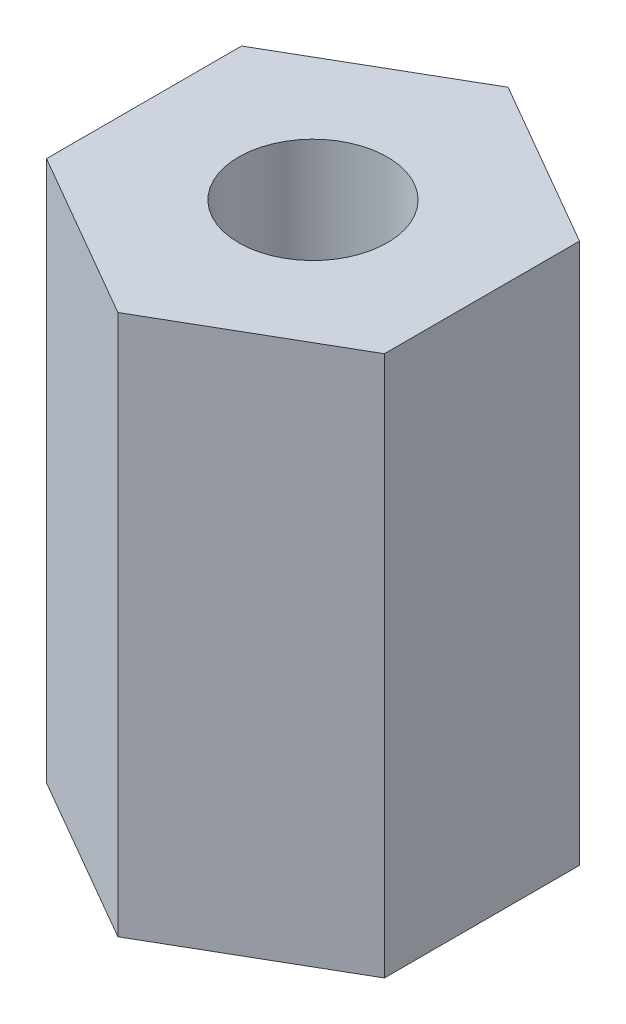
ISO-10303-21;
HEADER;
FILE_DESCRIPTION(('STEP AP214'),'2;1');
FILE_NAME('part.step','',(''),(''),'','','');
FILE_SCHEMA(('AUTOMOTIVE_DESIGN { 1 0 10303 214 1 1 1 1 }'));
ENDSEC;
DATA;
#1=APPLICATION_CONTEXT('core data for automotive mechanical design processes');
#2=APPLICATION_PROTOCOL_DEFINITION('international standard','automotive_design',2000,#1);
#3=PRODUCT_CONTEXT('',#1,'mechanical');
#4=PRODUCT('Part','Part','',(#3));
#5=PRODUCT_RELATED_PRODUCT_CATEGORY('part','',(#4));
#6=PRODUCT_DEFINITION_FORMATION('','',#4);
#7=PRODUCT_DEFINITION_CONTEXT('part definition',#1,'design');
#8=PRODUCT_DEFINITION('design','',#6,#7);
#9=PRODUCT_DEFINITION_SHAPE('','',#8);
#10=(LENGTH_UNIT() NAMED_UNIT(*) SI_UNIT(.MILLI.,.METRE.));
#11=(NAMED_UNIT(*) PLANE_ANGLE_UNIT() SI_UNIT($,.RADIAN.));
#12=(NAMED_UNIT(*) SI_UNIT($,.STERADIAN.) SOLID_ANGLE_UNIT());
#13=UNCERTAINTY_MEASURE_WITH_UNIT(LENGTH_MEASURE(1.E-05),#10,'distance_accuracy_value','');
#14=(GEOMETRIC_REPRESENTATION_CONTEXT(3) GLOBAL_UNCERTAINTY_ASSIGNED_CONTEXT((#13)) GLOBAL_UNIT_ASSIGNED_CONTEXT((#10,
#11,#12)) REPRESENTATION_CONTEXT('',''));
#15=CARTESIAN_POINT('',(0.,0.,0.));
#16=DIRECTION('',(0.,0.,1.));
#17=DIRECTION('',(1.,0.,0.));
#18=AXIS2_PLACEMENT_3D('',#15,#16,#17);
#19=CARTESIAN_POINT('',(0.,8.,0.));
#20=DIRECTION('',(0.,1.,0.));
#21=DIRECTION('',(0.,0.,1.));
#22=AXIS2_PLACEMENT_3D('',#19,#20,#21);
#23=PLANE('',#22);
#24=DIRECTION('',(-0.866025403784439,0.,-0.5));
#25=VECTOR('',#24,1.);
#26=CARTESIAN_POINT('',(2.5,8.,-1.44337567297407));
#27=LINE('',#26,#25);
#28=CARTESIAN_POINT('',(2.5,8.,-1.44337567297407));
#29=VERTEX_POINT('',#28);
#30=CARTESIAN_POINT('',(0.,8.,-2.88675134594813));
#31=VERTEX_POINT('',#30);
#32=EDGE_CURVE('E146',#29,#31,#27,.T.);
#33=ORIENTED_EDGE('',*,*,#32,.T.);
#34=DIRECTION('',(-0.866025403784439,0.,0.5));
#35=VECTOR('',#34,1.);
#36=CARTESIAN_POINT('',(0.,8.,-2.88675134594813));
#37=LINE('',#36,#35);
#38=CARTESIAN_POINT('',(-2.5,8.,-1.44337567297406));
#39=VERTEX_POINT('',#38);
#40=EDGE_CURVE('E94',#31,#39,#37,.T.);
#41=ORIENTED_EDGE('',*,*,#40,.T.);
#42=DIRECTION('',(0.,0.,1.));
#43=VECTOR('',#42,1.);
#44=CARTESIAN_POINT('',(-2.5,8.,-1.44337567297406));
#45=LINE('',#44,#43);
#46=CARTESIAN_POINT('',(-2.5,8.,1.44337567297406));
#47=VERTEX_POINT('',#46);
#48=EDGE_CURVE('E107',#39,#47,#45,.T.);
#49=ORIENTED_EDGE('',*,*,#48,.T.);
#50=DIRECTION('',(0.866025403784439,0.,0.5));
#51=VECTOR('',#50,1.);
#52=CARTESIAN_POINT('',(-2.5,8.,1.44337567297406));
#53=LINE('',#52,#51);
#54=CARTESIAN_POINT('',(0.,8.,2.88675134594813));
#55=VERTEX_POINT('',#54);
#56=EDGE_CURVE('E101',#47,#55,#53,.T.);
#57=ORIENTED_EDGE('',*,*,#56,.T.);
#58=DIRECTION('',(0.866025403784439,0.,-0.5));
#59=VECTOR('',#58,1.);
#60=CARTESIAN_POINT('',(0.,8.,2.88675134594813));
#61=LINE('',#60,#59);
#62=CARTESIAN_POINT('',(2.5,8.,1.44337567297406));
#63=VERTEX_POINT('',#62);
#64=EDGE_CURVE('E105',#55,#63,#61,.T.);
#65=ORIENTED_EDGE('',*,*,#64,.T.);
#66=DIRECTION('',(0.,0.,-1.));
#67=VECTOR('',#66,1.);
#68=CARTESIAN_POINT('',(2.5,8.,1.44337567297406));
#69=LINE('',#68,#67);
#70=EDGE_CURVE('E57',#63,#29,#69,.T.);
#71=ORIENTED_EDGE('',*,*,#70,.T.);
#72=EDGE_LOOP('',(#33,#41,#49,#57,#65,#71));
#73=FACE_BOUND('',#72,.T.);
#74=CARTESIAN_POINT('',(0.,8.,0.));
#75=DIRECTION('',(0.,1.,0.));
#76=DIRECTION('',(0.,0.,1.));
#77=AXIS2_PLACEMENT_3D('',#74,#75,#76);
#78=CIRCLE('',#77,1.1);
#79=CARTESIAN_POINT('',(0.,8.,1.1));
#80=VERTEX_POINT('',#79);
#81=EDGE_CURVE('E134',#80,#80,#78,.T.);
#82=ORIENTED_EDGE('',*,*,#81,.F.);
#83=EDGE_LOOP('',(#82));
#84=FACE_BOUND('',#83,.T.);
#85=ADVANCED_FACE('F39',(#73,#84),#23,.T.);
#86=CARTESIAN_POINT('',(0.,0.,0.));
#87=DIRECTION('',(0.,1.,0.));
#88=DIRECTION('',(0.,0.,1.));
#89=AXIS2_PLACEMENT_3D('',#86,#87,#88);
#90=PLANE('',#89);
#91=DIRECTION('',(-0.866025403784439,0.,-0.5));
#92=VECTOR('',#91,1.);
#93=CARTESIAN_POINT('',(2.5,0.,-1.44337567297407));
#94=LINE('',#93,#92);
#95=CARTESIAN_POINT('',(2.5,0.,-1.44337567297407));
#96=VERTEX_POINT('',#95);
#97=CARTESIAN_POINT('',(0.,0.,-2.88675134594813));
#98=VERTEX_POINT('',#97);
#99=EDGE_CURVE('E129',#96,#98,#94,.T.);
#100=ORIENTED_EDGE('',*,*,#99,.F.);
#101=DIRECTION('',(0.,0.,-1.));
#102=VECTOR('',#101,1.);
#103=CARTESIAN_POINT('',(2.5,0.,1.44337567297406));
#104=LINE('',#103,#102);
#105=CARTESIAN_POINT('',(2.5,0.,1.44337567297406));
#106=VERTEX_POINT('',#105);
#107=EDGE_CURVE('E86',#106,#96,#104,.T.);
#108=ORIENTED_EDGE('',*,*,#107,.F.);
#109=DIRECTION('',(0.866025403784439,0.,-0.5));
#110=VECTOR('',#109,1.);
#111=CARTESIAN_POINT('',(0.,0.,2.88675134594813));
#112=LINE('',#111,#110);
#113=CARTESIAN_POINT('',(0.,0.,2.88675134594813));
#114=VERTEX_POINT('',#113);
#115=EDGE_CURVE('E80',#114,#106,#112,.T.);
#116=ORIENTED_EDGE('',*,*,#115,.F.);
#117=DIRECTION('',(0.866025403784439,0.,0.5));
#118=VECTOR('',#117,1.);
#119=CARTESIAN_POINT('',(-2.5,0.,1.44337567297406));
#120=LINE('',#119,#118);
#121=CARTESIAN_POINT('',(-2.5,0.,1.44337567297406));
#122=VERTEX_POINT('',#121);
#123=EDGE_CURVE('E116',#122,#114,#120,.T.);
#124=ORIENTED_EDGE('',*,*,#123,.F.);
#125=DIRECTION('',(0.,0.,1.));
#126=VECTOR('',#125,1.);
#127=CARTESIAN_POINT('',(-2.5,0.,-1.44337567297406));
#128=LINE('',#127,#126);
#129=CARTESIAN_POINT('',(-2.5,0.,-1.44337567297406));
#130=VERTEX_POINT('',#129);
#131=EDGE_CURVE('E137',#130,#122,#128,.T.);
#132=ORIENTED_EDGE('',*,*,#131,.F.);
#133=DIRECTION('',(-0.866025403784439,0.,0.5));
#134=VECTOR('',#133,1.);
#135=CARTESIAN_POINT('',(0.,0.,-2.88675134594813));
#136=LINE('',#135,#134);
#137=EDGE_CURVE('E133',#98,#130,#136,.T.);
#138=ORIENTED_EDGE('',*,*,#137,.F.);
#139=EDGE_LOOP('',(#100,#108,#116,#124,#132,#138));
#140=FACE_BOUND('',#139,.T.);
#141=CARTESIAN_POINT('',(0.,0.,0.));
#142=DIRECTION('',(0.,1.,0.));
#143=DIRECTION('',(0.,0.,1.));
#144=AXIS2_PLACEMENT_3D('',#141,#142,#143);
#145=CIRCLE('',#144,1.1);
#146=CARTESIAN_POINT('',(0.,0.,1.1));
#147=VERTEX_POINT('',#146);
#148=EDGE_CURVE('E243',#147,#147,#145,.T.);
#149=ORIENTED_EDGE('',*,*,#148,.T.);
#150=EDGE_LOOP('',(#149));
#151=FACE_BOUND('',#150,.T.);
#152=ADVANCED_FACE('F159',(#140,#151),#90,.F.);
#153=CARTESIAN_POINT('',(2.5,8.,-1.44337567297407));
#154=DIRECTION('',(-0.5,0.,0.866025403784439));
#155=DIRECTION('',(0.866025403784439,0.,0.5));
#156=AXIS2_PLACEMENT_3D('',#153,#154,#155);
#157=PLANE('',#156);
#158=ORIENTED_EDGE('',*,*,#99,.T.);
#159=DIRECTION('',(0.,-1.,0.));
#160=VECTOR('',#159,1.);
#161=CARTESIAN_POINT('',(0.,8.,-2.88675134594813));
#162=LINE('',#161,#160);
#163=EDGE_CURVE('E11',#31,#98,#162,.T.);
#164=ORIENTED_EDGE('',*,*,#163,.F.);
#165=ORIENTED_EDGE('',*,*,#32,.F.);
#166=DIRECTION('',(0.,-1.,0.));
#167=VECTOR('',#166,1.);
#168=CARTESIAN_POINT('',(2.5,8.,-1.44337567297407));
#169=LINE('',#168,#167);
#170=EDGE_CURVE('E125',#29,#96,#169,.T.);
#171=ORIENTED_EDGE('',*,*,#170,.T.);
#172=EDGE_LOOP('',(#158,#164,#165,#171));
#173=FACE_BOUND('',#172,.T.);
#174=ADVANCED_FACE('F41',(#173),#157,.F.);
#175=CARTESIAN_POINT('',(0.,8.,-2.88675134594813));
#176=DIRECTION('',(0.5,0.,0.866025403784439));
#177=DIRECTION('',(0.866025403784439,0.,-0.5));
#178=AXIS2_PLACEMENT_3D('',#175,#176,#177);
#179=PLANE('',#178);
#180=ORIENTED_EDGE('',*,*,#137,.T.);
#181=DIRECTION('',(0.,-1.,0.));
#182=VECTOR('',#181,1.);
#183=CARTESIAN_POINT('',(-2.5,8.,-1.44337567297406));
#184=LINE('',#183,#182);
#185=EDGE_CURVE('E49',#39,#130,#184,.T.);
#186=ORIENTED_EDGE('',*,*,#185,.F.);
#187=ORIENTED_EDGE('',*,*,#40,.F.);
#188=ORIENTED_EDGE('',*,*,#163,.T.);
#189=EDGE_LOOP('',(#180,#186,#187,#188));
#190=FACE_BOUND('',#189,.T.);
#191=ADVANCED_FACE('F184',(#190),#179,.F.);
#192=CARTESIAN_POINT('',(-2.5,8.,-1.44337567297406));
#193=DIRECTION('',(1.,0.,0.));
#194=DIRECTION('',(0.,0.,-1.));
#195=AXIS2_PLACEMENT_3D('',#192,#193,#194);
#196=PLANE('',#195);
#197=ORIENTED_EDGE('',*,*,#131,.T.);
#198=DIRECTION('',(0.,-1.,0.));
#199=VECTOR('',#198,1.);
#200=CARTESIAN_POINT('',(-2.5,8.,1.44337567297406));
#201=LINE('',#200,#199);
#202=EDGE_CURVE('E118',#47,#122,#201,.T.);
#203=ORIENTED_EDGE('',*,*,#202,.F.);
#204=ORIENTED_EDGE('',*,*,#48,.F.);
#205=ORIENTED_EDGE('',*,*,#185,.T.);
#206=EDGE_LOOP('',(#197,#203,#204,#205));
#207=FACE_BOUND('',#206,.T.);
#208=ADVANCED_FACE('F156',(#207),#196,.F.);
#209=CARTESIAN_POINT('',(-2.5,8.,1.44337567297406));
#210=DIRECTION('',(0.5,0.,-0.866025403784439));
#211=DIRECTION('',(-0.866025403784439,0.,-0.5));
#212=AXIS2_PLACEMENT_3D('',#209,#210,#211);
#213=PLANE('',#212);
#214=ORIENTED_EDGE('',*,*,#123,.T.);
#215=DIRECTION('',(0.,-1.,0.));
#216=VECTOR('',#215,1.);
#217=CARTESIAN_POINT('',(0.,8.,2.88675134594813));
#218=LINE('',#217,#216);
#219=EDGE_CURVE('E113',#55,#114,#218,.T.);
#220=ORIENTED_EDGE('',*,*,#219,.F.);
#221=ORIENTED_EDGE('',*,*,#56,.F.);
#222=ORIENTED_EDGE('',*,*,#202,.T.);
#223=EDGE_LOOP('',(#214,#220,#221,#222));
#224=FACE_BOUND('',#223,.T.);
#225=ADVANCED_FACE('F114',(#224),#213,.F.);
#226=CARTESIAN_POINT('',(0.,8.,2.88675134594813));
#227=DIRECTION('',(-0.5,0.,-0.866025403784439));
#228=DIRECTION('',(-0.866025403784439,0.,0.5));
#229=AXIS2_PLACEMENT_3D('',#226,#227,#228);
#230=PLANE('',#229);
#231=ORIENTED_EDGE('',*,*,#115,.T.);
#232=DIRECTION('',(0.,-1.,0.));
#233=VECTOR('',#232,1.);
#234=CARTESIAN_POINT('',(2.5,8.,1.44337567297406));
#235=LINE('',#234,#233);
#236=EDGE_CURVE('E119',#63,#106,#235,.T.);
#237=ORIENTED_EDGE('',*,*,#236,.F.);
#238=ORIENTED_EDGE('',*,*,#64,.F.);
#239=ORIENTED_EDGE('',*,*,#219,.T.);
#240=EDGE_LOOP('',(#231,#237,#238,#239));
#241=FACE_BOUND('',#240,.T.);
#242=ADVANCED_FACE('F121',(#241),#230,.F.);
#243=CARTESIAN_POINT('',(2.5,8.,1.44337567297406));
#244=DIRECTION('',(-1.,0.,0.));
#245=DIRECTION('',(0.,0.,1.));
#246=AXIS2_PLACEMENT_3D('',#243,#244,#245);
#247=PLANE('',#246);
#248=ORIENTED_EDGE('',*,*,#107,.T.);
#249=ORIENTED_EDGE('',*,*,#170,.F.);
#250=ORIENTED_EDGE('',*,*,#70,.F.);
#251=ORIENTED_EDGE('',*,*,#236,.T.);
#252=EDGE_LOOP('',(#248,#249,#250,#251));
#253=FACE_BOUND('',#252,.T.);
#254=ADVANCED_FACE('F164',(#253),#247,.F.);
#255=CARTESIAN_POINT('',(0.,8.,0.));
#256=DIRECTION('',(0.,-1.,0.));
#257=DIRECTION('',(0.,0.,-1.));
#258=AXIS2_PLACEMENT_3D('',#255,#256,#257);
#259=CYLINDRICAL_SURFACE('',#258,1.1);
#260=ORIENTED_EDGE('',*,*,#81,.T.);
#261=EDGE_LOOP('',(#260));
#262=FACE_BOUND('',#261,.T.);
#263=ORIENTED_EDGE('',*,*,#148,.F.);
#264=EDGE_LOOP('',(#263));
#265=FACE_BOUND('',#264,.T.);
#266=ADVANCED_FACE('F166',(#262,#265),#259,.F.);
#267=CLOSED_SHELL('',(#85,#152,#174,#191,#208,#225,#242,#254,#266));
#268=MANIFOLD_SOLID_BREP('B2',#267);
#269=ADVANCED_BREP_SHAPE_REPRESENTATION('',(#18,#268),#14);
#270=SHAPE_DEFINITION_REPRESENTATION(#9,#269);
ENDSEC;
END-ISO-10303-21;
